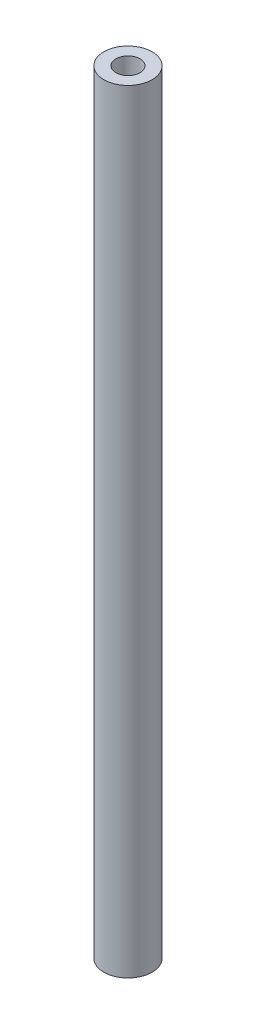
ISO-10303-21;
HEADER;
FILE_DESCRIPTION(('STEP AP214'),'2;1');
FILE_NAME('part.step','',(''),(''),'','','');
FILE_SCHEMA(('AUTOMOTIVE_DESIGN { 1 0 10303 214 1 1 1 1 }'));
ENDSEC;
DATA;
#1=APPLICATION_CONTEXT('core data for automotive mechanical design processes');
#2=APPLICATION_PROTOCOL_DEFINITION('international standard','automotive_design',2000,#1);
#3=PRODUCT_CONTEXT('',#1,'mechanical');
#4=PRODUCT('Part','Part','',(#3));
#5=PRODUCT_RELATED_PRODUCT_CATEGORY('part','',(#4));
#6=PRODUCT_DEFINITION_FORMATION('','',#4);
#7=PRODUCT_DEFINITION_CONTEXT('part definition',#1,'design');
#8=PRODUCT_DEFINITION('design','',#6,#7);
#9=PRODUCT_DEFINITION_SHAPE('','',#8);
#10=(LENGTH_UNIT() NAMED_UNIT(*) SI_UNIT(.MILLI.,.METRE.));
#11=(NAMED_UNIT(*) PLANE_ANGLE_UNIT() SI_UNIT($,.RADIAN.));
#12=(NAMED_UNIT(*) SI_UNIT($,.STERADIAN.) SOLID_ANGLE_UNIT());
#13=UNCERTAINTY_MEASURE_WITH_UNIT(LENGTH_MEASURE(1.E-05),#10,'distance_accuracy_value','');
#14=(GEOMETRIC_REPRESENTATION_CONTEXT(3) GLOBAL_UNCERTAINTY_ASSIGNED_CONTEXT((#13)) GLOBAL_UNIT_ASSIGNED_CONTEXT((#10,
#11,#12)) REPRESENTATION_CONTEXT('',''));
#15=CARTESIAN_POINT('',(0.,0.,0.));
#16=DIRECTION('',(0.,0.,1.));
#17=DIRECTION('',(1.,0.,0.));
#18=AXIS2_PLACEMENT_3D('',#15,#16,#17);
#19=CARTESIAN_POINT('',(0.,203.2,0.));
#20=DIRECTION('',(0.,1.,0.));
#21=DIRECTION('',(0.,0.,1.));
#22=AXIS2_PLACEMENT_3D('',#19,#20,#21);
#23=PLANE('',#22);
#24=CARTESIAN_POINT('',(0.,203.2,0.));
#25=DIRECTION('',(0.,1.,0.));
#26=DIRECTION('',(0.,0.,1.));
#27=AXIS2_PLACEMENT_3D('',#24,#25,#26);
#28=CIRCLE('',#27,6.35);
#29=CARTESIAN_POINT('',(0.,203.2,6.35));
#30=VERTEX_POINT('',#29);
#31=EDGE_CURVE('E10',#30,#30,#28,.T.);
#32=ORIENTED_EDGE('',*,*,#31,.T.);
#33=EDGE_LOOP('',(#32));
#34=FACE_BOUND('',#33,.T.);
#35=CARTESIAN_POINT('',(0.,203.2,0.));
#36=DIRECTION('',(0.,1.,0.));
#37=DIRECTION('',(0.,0.,1.));
#38=AXIS2_PLACEMENT_3D('',#35,#36,#37);
#39=CIRCLE('',#38,3.175);
#40=CARTESIAN_POINT('',(0.,203.2,3.175));
#41=VERTEX_POINT('',#40);
#42=EDGE_CURVE('E50',#41,#41,#39,.T.);
#43=ORIENTED_EDGE('',*,*,#42,.F.);
#44=EDGE_LOOP('',(#43));
#45=FACE_BOUND('',#44,.T.);
#46=ADVANCED_FACE('F37',(#34,#45),#23,.T.);
#47=CARTESIAN_POINT('',(0.,0.,0.));
#48=DIRECTION('',(0.,1.,0.));
#49=DIRECTION('',(0.,0.,1.));
#50=AXIS2_PLACEMENT_3D('',#47,#48,#49);
#51=PLANE('',#50);
#52=CARTESIAN_POINT('',(0.,0.,0.));
#53=DIRECTION('',(0.,1.,0.));
#54=DIRECTION('',(0.,0.,1.));
#55=AXIS2_PLACEMENT_3D('',#52,#53,#54);
#56=CIRCLE('',#55,6.35);
#57=CARTESIAN_POINT('',(0.,0.,6.35));
#58=VERTEX_POINT('',#57);
#59=EDGE_CURVE('E41',#58,#58,#56,.T.);
#60=ORIENTED_EDGE('',*,*,#59,.F.);
#61=EDGE_LOOP('',(#60));
#62=FACE_BOUND('',#61,.T.);
#63=CARTESIAN_POINT('',(0.,0.,0.));
#64=DIRECTION('',(0.,1.,0.));
#65=DIRECTION('',(0.,0.,1.));
#66=AXIS2_PLACEMENT_3D('',#63,#64,#65);
#67=CIRCLE('',#66,3.175);
#68=CARTESIAN_POINT('',(0.,0.,3.175));
#69=VERTEX_POINT('',#68);
#70=EDGE_CURVE('E52',#69,#69,#67,.T.);
#71=ORIENTED_EDGE('',*,*,#70,.T.);
#72=EDGE_LOOP('',(#71));
#73=FACE_BOUND('',#72,.T.);
#74=ADVANCED_FACE('F64',(#62,#73),#51,.F.);
#75=CARTESIAN_POINT('',(0.,203.2,0.));
#76=DIRECTION('',(0.,-1.,0.));
#77=DIRECTION('',(0.,0.,-1.));
#78=AXIS2_PLACEMENT_3D('',#75,#76,#77);
#79=CYLINDRICAL_SURFACE('',#78,6.35);
#80=ORIENTED_EDGE('',*,*,#31,.F.);
#81=EDGE_LOOP('',(#80));
#82=FACE_BOUND('',#81,.T.);
#83=ORIENTED_EDGE('',*,*,#59,.T.);
#84=EDGE_LOOP('',(#83));
#85=FACE_BOUND('',#84,.T.);
#86=ADVANCED_FACE('F39',(#82,#85),#79,.T.);
#87=CARTESIAN_POINT('',(0.,203.2,0.));
#88=DIRECTION('',(0.,-1.,0.));
#89=DIRECTION('',(0.,0.,-1.));
#90=AXIS2_PLACEMENT_3D('',#87,#88,#89);
#91=CYLINDRICAL_SURFACE('',#90,3.175);
#92=ORIENTED_EDGE('',*,*,#42,.T.);
#93=EDGE_LOOP('',(#92));
#94=FACE_BOUND('',#93,.T.);
#95=ORIENTED_EDGE('',*,*,#70,.F.);
#96=EDGE_LOOP('',(#95));
#97=FACE_BOUND('',#96,.T.);
#98=ADVANCED_FACE('F60',(#94,#97),#91,.F.);
#99=CLOSED_SHELL('',(#46,#74,#86,#98));
#100=MANIFOLD_SOLID_BREP('B2',#99);
#101=ADVANCED_BREP_SHAPE_REPRESENTATION('',(#18,#100),#14);
#102=SHAPE_DEFINITION_REPRESENTATION(#9,#101);
ENDSEC;
END-ISO-10303-21;
